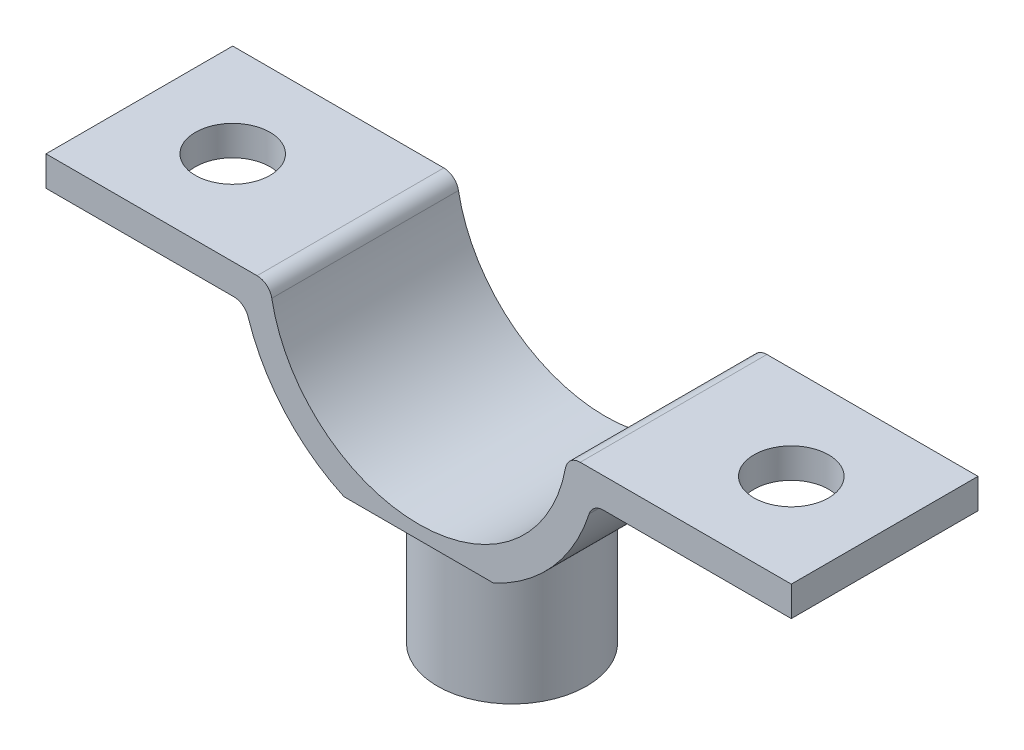
ISO-10303-21;
HEADER;
FILE_DESCRIPTION(('STEP AP214'),'2;1');
FILE_NAME('part.step','',(''),(''),'','','');
FILE_SCHEMA(('AUTOMOTIVE_DESIGN { 1 0 10303 214 1 1 1 1 }'));
ENDSEC;
DATA;
#1=APPLICATION_CONTEXT('core data for automotive mechanical design processes');
#2=APPLICATION_PROTOCOL_DEFINITION('international standard','automotive_design',2000,#1);
#3=PRODUCT_CONTEXT('',#1,'mechanical');
#4=PRODUCT('Part','Part','',(#3));
#5=PRODUCT_RELATED_PRODUCT_CATEGORY('part','',(#4));
#6=PRODUCT_DEFINITION_FORMATION('','',#4);
#7=PRODUCT_DEFINITION_CONTEXT('part definition',#1,'design');
#8=PRODUCT_DEFINITION('design','',#6,#7);
#9=PRODUCT_DEFINITION_SHAPE('','',#8);
#10=(LENGTH_UNIT() NAMED_UNIT(*) SI_UNIT(.MILLI.,.METRE.));
#11=(NAMED_UNIT(*) PLANE_ANGLE_UNIT() SI_UNIT($,.RADIAN.));
#12=(NAMED_UNIT(*) SI_UNIT($,.STERADIAN.) SOLID_ANGLE_UNIT());
#13=UNCERTAINTY_MEASURE_WITH_UNIT(LENGTH_MEASURE(1.E-05),#10,'distance_accuracy_value','');
#14=(GEOMETRIC_REPRESENTATION_CONTEXT(3) GLOBAL_UNCERTAINTY_ASSIGNED_CONTEXT((#13)) GLOBAL_UNIT_ASSIGNED_CONTEXT((#10,
#11,#12)) REPRESENTATION_CONTEXT('',''));
#15=CARTESIAN_POINT('',(0.,0.,0.));
#16=DIRECTION('',(0.,0.,1.));
#17=DIRECTION('',(1.,0.,0.));
#18=AXIS2_PLACEMENT_3D('',#15,#16,#17);
#19=CARTESIAN_POINT('',(12.369316876853,16.0173195198486,12.5));
#20=DIRECTION('',(0.,0.,-1.));
#21=DIRECTION('',(-1.,0.,0.));
#22=AXIS2_PLACEMENT_3D('',#19,#20,#21);
#23=CYLINDRICAL_SURFACE('',#22,1.);
#24=CARTESIAN_POINT('',(12.369316876853,16.0173195198486,0.));
#25=DIRECTION('',(0.,0.,-1.));
#26=DIRECTION('',(1.,0.,0.));
#27=AXIS2_PLACEMENT_3D('',#24,#25,#26);
#28=CIRCLE('',#27,1.);
#29=CARTESIAN_POINT('',(11.4178309632489,16.3250118275409,0.));
#30=VERTEX_POINT('',#29);
#31=CARTESIAN_POINT('',(12.369316876853,17.0173195198486,0.));
#32=VERTEX_POINT('',#31);
#33=EDGE_CURVE('E166',#30,#32,#28,.T.);
#34=ORIENTED_EDGE('',*,*,#33,.T.);
#35=DIRECTION('',(0.,0.,-1.));
#36=VECTOR('',#35,1.);
#37=CARTESIAN_POINT('',(12.369316876853,17.0173195198486,12.5));
#38=LINE('',#37,#36);
#39=CARTESIAN_POINT('',(12.369316876853,17.0173195198486,12.5));
#40=VERTEX_POINT('',#39);
#41=EDGE_CURVE('E164',#40,#32,#38,.T.);
#42=ORIENTED_EDGE('',*,*,#41,.F.);
#43=CARTESIAN_POINT('',(12.369316876853,16.0173195198486,12.5));
#44=DIRECTION('',(0.,0.,-1.));
#45=DIRECTION('',(1.,0.,0.));
#46=AXIS2_PLACEMENT_3D('',#43,#44,#45);
#47=CIRCLE('',#46,1.);
#48=CARTESIAN_POINT('',(11.4178309632489,16.3250118275409,12.5));
#49=VERTEX_POINT('',#48);
#50=EDGE_CURVE('E147',#49,#40,#47,.T.);
#51=ORIENTED_EDGE('',*,*,#50,.F.);
#52=DIRECTION('',(0.,0.,-1.));
#53=VECTOR('',#52,1.);
#54=CARTESIAN_POINT('',(11.4178309632489,16.3250118275409,12.5));
#55=LINE('',#54,#53);
#56=EDGE_CURVE('E169',#49,#30,#55,.T.);
#57=ORIENTED_EDGE('',*,*,#56,.T.);
#58=EDGE_LOOP('',(#34,#42,#51,#57));
#59=FACE_BOUND('',#58,.T.);
#60=ADVANCED_FACE('F44',(#59),#23,.F.);
#61=CARTESIAN_POINT('',(24.9498743710662,17.0173195198486,12.5));
#62=DIRECTION('',(0.,1.,0.));
#63=DIRECTION('',(0.,0.,1.));
#64=AXIS2_PLACEMENT_3D('',#61,#62,#63);
#65=PLANE('',#64);
#66=CARTESIAN_POINT('',(18.6998743710662,17.0173195198486,6.25));
#67=DIRECTION('',(0.,1.,0.));
#68=DIRECTION('',(0.,0.,1.));
#69=AXIS2_PLACEMENT_3D('',#66,#67,#68);
#70=CIRCLE('',#69,2.5);
#71=CARTESIAN_POINT('',(18.6998743710662,17.0173195198486,8.75));
#72=VERTEX_POINT('',#71);
#73=EDGE_CURVE('E335',#72,#72,#70,.F.);
#74=ORIENTED_EDGE('',*,*,#73,.F.);
#75=EDGE_LOOP('',(#74));
#76=FACE_BOUND('',#75,.T.);
#77=DIRECTION('',(1.,0.,0.));
#78=VECTOR('',#77,1.);
#79=CARTESIAN_POINT('',(24.9498743710662,17.0173195198486,0.));
#80=LINE('',#79,#78);
#81=CARTESIAN_POINT('',(24.9498743710662,17.0173195198486,0.));
#82=VERTEX_POINT('',#81);
#83=EDGE_CURVE('E216',#32,#82,#80,.T.);
#84=ORIENTED_EDGE('',*,*,#83,.T.);
#85=DIRECTION('',(0.,0.,-1.));
#86=VECTOR('',#85,1.);
#87=CARTESIAN_POINT('',(24.9498743710662,17.0173195198486,12.5));
#88=LINE('',#87,#86);
#89=CARTESIAN_POINT('',(24.9498743710662,17.0173195198486,12.5));
#90=VERTEX_POINT('',#89);
#91=EDGE_CURVE('E170',#90,#82,#88,.T.);
#92=ORIENTED_EDGE('',*,*,#91,.F.);
#93=DIRECTION('',(1.,0.,0.));
#94=VECTOR('',#93,1.);
#95=CARTESIAN_POINT('',(19.9498743710662,17.0173195198486,12.5));
#96=LINE('',#95,#94);
#97=EDGE_CURVE('E152',#40,#90,#96,.T.);
#98=ORIENTED_EDGE('',*,*,#97,.F.);
#99=ORIENTED_EDGE('',*,*,#41,.T.);
#100=EDGE_LOOP('',(#84,#92,#98,#99));
#101=FACE_BOUND('',#100,.T.);
#102=ADVANCED_FACE('F172',(#76,#101),#65,.F.);
#103=CARTESIAN_POINT('',(24.9498743710662,19.0173195198486,12.5));
#104=DIRECTION('',(-1.,0.,0.));
#105=DIRECTION('',(0.,0.,1.));
#106=AXIS2_PLACEMENT_3D('',#103,#104,#105);
#107=PLANE('',#106);
#108=DIRECTION('',(0.,1.,0.));
#109=VECTOR('',#108,1.);
#110=CARTESIAN_POINT('',(24.9498743710662,19.0173195198486,0.));
#111=LINE('',#110,#109);
#112=CARTESIAN_POINT('',(24.9498743710662,19.0173195198486,0.));
#113=VERTEX_POINT('',#112);
#114=EDGE_CURVE('E219',#82,#113,#111,.T.);
#115=ORIENTED_EDGE('',*,*,#114,.T.);
#116=DIRECTION('',(0.,0.,-1.));
#117=VECTOR('',#116,1.);
#118=CARTESIAN_POINT('',(24.9498743710662,19.0173195198486,12.5));
#119=LINE('',#118,#117);
#120=CARTESIAN_POINT('',(24.9498743710662,19.0173195198486,12.5));
#121=VERTEX_POINT('',#120);
#122=EDGE_CURVE('E177',#121,#113,#119,.T.);
#123=ORIENTED_EDGE('',*,*,#122,.F.);
#124=DIRECTION('',(0.,1.,0.));
#125=VECTOR('',#124,1.);
#126=CARTESIAN_POINT('',(24.9498743710662,19.0173195198486,12.5));
#127=LINE('',#126,#125);
#128=EDGE_CURVE('E68',#90,#121,#127,.T.);
#129=ORIENTED_EDGE('',*,*,#128,.F.);
#130=ORIENTED_EDGE('',*,*,#91,.T.);
#131=EDGE_LOOP('',(#115,#123,#129,#130));
#132=FACE_BOUND('',#131,.T.);
#133=ADVANCED_FACE('F388',(#132),#107,.F.);
#134=CARTESIAN_POINT('',(10.816653826392,19.0173195198486,12.5));
#135=DIRECTION('',(0.,-1.,0.));
#136=DIRECTION('',(0.,0.,-1.));
#137=AXIS2_PLACEMENT_3D('',#134,#135,#136);
#138=PLANE('',#137);
#139=CARTESIAN_POINT('',(18.6998743710661,19.0173195198487,6.25));
#140=DIRECTION('',(0.,1.,0.));
#141=DIRECTION('',(1.,0.,0.));
#142=AXIS2_PLACEMENT_3D('',#139,#140,#141);
#143=CIRCLE('',#142,2.5);
#144=CARTESIAN_POINT('',(21.1998743710662,19.0173195198487,6.25));
#145=VERTEX_POINT('',#144);
#146=EDGE_CURVE('E340',#145,#145,#143,.T.);
#147=ORIENTED_EDGE('',*,*,#146,.F.);
#148=EDGE_LOOP('',(#147));
#149=FACE_BOUND('',#148,.T.);
#150=DIRECTION('',(-1.,0.,0.));
#151=VECTOR('',#150,1.);
#152=CARTESIAN_POINT('',(10.816653826392,19.0173195198486,0.));
#153=LINE('',#152,#151);
#154=CARTESIAN_POINT('',(10.816653826392,19.0173195198486,0.));
#155=VERTEX_POINT('',#154);
#156=EDGE_CURVE('E113',#113,#155,#153,.T.);
#157=ORIENTED_EDGE('',*,*,#156,.T.);
#158=DIRECTION('',(0.,0.,-1.));
#159=VECTOR('',#158,1.);
#160=CARTESIAN_POINT('',(10.816653826392,19.0173195198486,12.5));
#161=LINE('',#160,#159);
#162=CARTESIAN_POINT('',(10.816653826392,19.0173195198486,12.5));
#163=VERTEX_POINT('',#162);
#164=EDGE_CURVE('E53',#163,#155,#161,.T.);
#165=ORIENTED_EDGE('',*,*,#164,.F.);
#166=DIRECTION('',(-1.,0.,0.));
#167=VECTOR('',#166,1.);
#168=CARTESIAN_POINT('',(19.9498743710662,19.0173195198486,12.5));
#169=LINE('',#168,#167);
#170=EDGE_CURVE('E119',#121,#163,#169,.T.);
#171=ORIENTED_EDGE('',*,*,#170,.F.);
#172=ORIENTED_EDGE('',*,*,#122,.T.);
#173=EDGE_LOOP('',(#157,#165,#171,#172));
#174=FACE_BOUND('',#173,.T.);
#175=ADVANCED_FACE('F46',(#149,#174),#138,.F.);
#176=CARTESIAN_POINT('',(10.816653826392,18.0173195198486,12.5));
#177=DIRECTION('',(0.,0.,-1.));
#178=DIRECTION('',(-1.,0.,0.));
#179=AXIS2_PLACEMENT_3D('',#176,#177,#178);
#180=CYLINDRICAL_SURFACE('',#179,1.);
#181=CARTESIAN_POINT('',(10.816653826392,18.0173195198486,0.));
#182=DIRECTION('',(0.,0.,1.));
#183=DIRECTION('',(1.,0.,0.));
#184=AXIS2_PLACEMENT_3D('',#181,#182,#183);
#185=CIRCLE('',#184,1.);
#186=CARTESIAN_POINT('',(9.83332166035634,18.1991377016668,0.));
#187=VERTEX_POINT('',#186);
#188=EDGE_CURVE('E183',#155,#187,#185,.T.);
#189=ORIENTED_EDGE('',*,*,#188,.T.);
#190=DIRECTION('',(0.,0.,-1.));
#191=VECTOR('',#190,1.);
#192=CARTESIAN_POINT('',(9.83332166035634,18.1991377016668,12.5));
#193=LINE('',#192,#191);
#194=CARTESIAN_POINT('',(9.83332166035634,18.1991377016668,12.5));
#195=VERTEX_POINT('',#194);
#196=EDGE_CURVE('E253',#195,#187,#193,.T.);
#197=ORIENTED_EDGE('',*,*,#196,.F.);
#198=CARTESIAN_POINT('',(10.816653826392,18.0173195198486,12.5));
#199=DIRECTION('',(0.,0.,1.));
#200=DIRECTION('',(1.,0.,0.));
#201=AXIS2_PLACEMENT_3D('',#198,#199,#200);
#202=CIRCLE('',#201,1.);
#203=EDGE_CURVE('E262',#163,#195,#202,.T.);
#204=ORIENTED_EDGE('',*,*,#203,.F.);
#205=ORIENTED_EDGE('',*,*,#164,.T.);
#206=EDGE_LOOP('',(#189,#197,#204,#205));
#207=FACE_BOUND('',#206,.T.);
#208=ADVANCED_FACE('F260',(#207),#180,.T.);
#209=CARTESIAN_POINT('',(0.,20.0173195198486,12.5));
#210=DIRECTION('',(0.,0.,-1.));
#211=DIRECTION('',(-1.,0.,0.));
#212=AXIS2_PLACEMENT_3D('',#209,#210,#211);
#213=CYLINDRICAL_SURFACE('',#212,10.);
#214=CARTESIAN_POINT('',(0.,20.0173195198486,0.));
#215=DIRECTION('',(0.,0.,-1.));
#216=DIRECTION('',(1.,0.,0.));
#217=AXIS2_PLACEMENT_3D('',#214,#215,#216);
#218=CIRCLE('',#217,10.);
#219=CARTESIAN_POINT('',(-9.83332166035634,18.1991377016668,0.));
#220=VERTEX_POINT('',#219);
#221=EDGE_CURVE('E187',#187,#220,#218,.T.);
#222=ORIENTED_EDGE('',*,*,#221,.T.);
#223=DIRECTION('',(0.,0.,-1.));
#224=VECTOR('',#223,1.);
#225=CARTESIAN_POINT('',(-9.83332166035634,18.1991377016668,12.5));
#226=LINE('',#225,#224);
#227=CARTESIAN_POINT('',(-9.83332166035634,18.1991377016668,12.5));
#228=VERTEX_POINT('',#227);
#229=EDGE_CURVE('E249',#228,#220,#226,.T.);
#230=ORIENTED_EDGE('',*,*,#229,.F.);
#231=CARTESIAN_POINT('',(0.,20.0173195198486,12.5));
#232=DIRECTION('',(0.,0.,-1.));
#233=DIRECTION('',(1.,0.,0.));
#234=AXIS2_PLACEMENT_3D('',#231,#232,#233);
#235=CIRCLE('',#234,10.);
#236=EDGE_CURVE('E279',#195,#228,#235,.T.);
#237=ORIENTED_EDGE('',*,*,#236,.F.);
#238=ORIENTED_EDGE('',*,*,#196,.T.);
#239=EDGE_LOOP('',(#222,#230,#237,#238));
#240=FACE_BOUND('',#239,.T.);
#241=ADVANCED_FACE('F269',(#240),#213,.F.);
#242=CARTESIAN_POINT('',(-10.816653826392,18.0173195198486,12.5));
#243=DIRECTION('',(0.,0.,-1.));
#244=DIRECTION('',(-1.,0.,0.));
#245=AXIS2_PLACEMENT_3D('',#242,#243,#244);
#246=CYLINDRICAL_SURFACE('',#245,1.);
#247=CARTESIAN_POINT('',(-10.816653826392,18.0173195198486,0.));
#248=DIRECTION('',(0.,0.,1.));
#249=DIRECTION('',(-1.,0.,0.));
#250=AXIS2_PLACEMENT_3D('',#247,#248,#249);
#251=CIRCLE('',#250,1.);
#252=CARTESIAN_POINT('',(-10.816653826392,19.0173195198486,0.));
#253=VERTEX_POINT('',#252);
#254=EDGE_CURVE('E190',#220,#253,#251,.T.);
#255=ORIENTED_EDGE('',*,*,#254,.T.);
#256=DIRECTION('',(0.,0.,-1.));
#257=VECTOR('',#256,1.);
#258=CARTESIAN_POINT('',(-10.816653826392,19.0173195198486,12.5));
#259=LINE('',#258,#257);
#260=CARTESIAN_POINT('',(-10.816653826392,19.0173195198486,12.5));
#261=VERTEX_POINT('',#260);
#262=EDGE_CURVE('E245',#261,#253,#259,.T.);
#263=ORIENTED_EDGE('',*,*,#262,.F.);
#264=CARTESIAN_POINT('',(-10.816653826392,18.0173195198486,12.5));
#265=DIRECTION('',(0.,0.,1.));
#266=DIRECTION('',(-1.,0.,0.));
#267=AXIS2_PLACEMENT_3D('',#264,#265,#266);
#268=CIRCLE('',#267,1.);
#269=EDGE_CURVE('E275',#228,#261,#268,.T.);
#270=ORIENTED_EDGE('',*,*,#269,.F.);
#271=ORIENTED_EDGE('',*,*,#229,.T.);
#272=EDGE_LOOP('',(#255,#263,#270,#271));
#273=FACE_BOUND('',#272,.T.);
#274=ADVANCED_FACE('F273',(#273),#246,.T.);
#275=CARTESIAN_POINT('',(-19.9498743710662,19.0173195198486,12.5));
#276=DIRECTION('',(0.,-1.,0.));
#277=DIRECTION('',(1.,0.,0.));
#278=AXIS2_PLACEMENT_3D('',#275,#276,#277);
#279=PLANE('',#278);
#280=CARTESIAN_POINT('',(-18.6998743710662,19.0173195198486,6.25));
#281=DIRECTION('',(0.,1.,0.));
#282=DIRECTION('',(-1.,0.,0.));
#283=AXIS2_PLACEMENT_3D('',#280,#281,#282);
#284=CIRCLE('',#283,2.5);
#285=CARTESIAN_POINT('',(-21.1998743710662,19.0173195198486,6.25));
#286=VERTEX_POINT('',#285);
#287=EDGE_CURVE('E339',#286,#286,#284,.T.);
#288=ORIENTED_EDGE('',*,*,#287,.F.);
#289=EDGE_LOOP('',(#288));
#290=FACE_BOUND('',#289,.T.);
#291=DIRECTION('',(-1.,0.,0.));
#292=VECTOR('',#291,1.);
#293=CARTESIAN_POINT('',(-19.9498743710662,19.0173195198486,0.));
#294=LINE('',#293,#292);
#295=CARTESIAN_POINT('',(-24.9498743710662,19.0173195198486,0.));
#296=VERTEX_POINT('',#295);
#297=EDGE_CURVE('E194',#253,#296,#294,.T.);
#298=ORIENTED_EDGE('',*,*,#297,.T.);
#299=DIRECTION('',(0.,0.,-1.));
#300=VECTOR('',#299,1.);
#301=CARTESIAN_POINT('',(-24.9498743710662,19.0173195198486,12.5));
#302=LINE('',#301,#300);
#303=CARTESIAN_POINT('',(-24.9498743710662,19.0173195198486,12.5));
#304=VERTEX_POINT('',#303);
#305=EDGE_CURVE('E241',#304,#296,#302,.T.);
#306=ORIENTED_EDGE('',*,*,#305,.F.);
#307=DIRECTION('',(-1.,0.,0.));
#308=VECTOR('',#307,1.);
#309=CARTESIAN_POINT('',(-10.816653826392,19.0173195198486,12.5));
#310=LINE('',#309,#308);
#311=EDGE_CURVE('E278',#261,#304,#310,.T.);
#312=ORIENTED_EDGE('',*,*,#311,.F.);
#313=ORIENTED_EDGE('',*,*,#262,.T.);
#314=EDGE_LOOP('',(#298,#306,#312,#313));
#315=FACE_BOUND('',#314,.T.);
#316=ADVANCED_FACE('F354',(#290,#315),#279,.F.);
#317=CARTESIAN_POINT('',(-24.9498743710662,19.0173195198486,12.5));
#318=DIRECTION('',(1.,0.,0.));
#319=DIRECTION('',(0.,0.,-1.));
#320=AXIS2_PLACEMENT_3D('',#317,#318,#319);
#321=PLANE('',#320);
#322=DIRECTION('',(0.,-1.,0.));
#323=VECTOR('',#322,1.);
#324=CARTESIAN_POINT('',(-24.9498743710662,19.0173195198486,0.));
#325=LINE('',#324,#323);
#326=CARTESIAN_POINT('',(-24.9498743710662,17.0173195198486,0.));
#327=VERTEX_POINT('',#326);
#328=EDGE_CURVE('E197',#296,#327,#325,.T.);
#329=ORIENTED_EDGE('',*,*,#328,.T.);
#330=DIRECTION('',(0.,0.,-1.));
#331=VECTOR('',#330,1.);
#332=CARTESIAN_POINT('',(-24.9498743710662,17.0173195198486,12.5));
#333=LINE('',#332,#331);
#334=CARTESIAN_POINT('',(-24.9498743710662,17.0173195198486,12.5));
#335=VERTEX_POINT('',#334);
#336=EDGE_CURVE('E237',#335,#327,#333,.T.);
#337=ORIENTED_EDGE('',*,*,#336,.F.);
#338=DIRECTION('',(0.,-1.,0.));
#339=VECTOR('',#338,1.);
#340=CARTESIAN_POINT('',(-24.9498743710662,19.0173195198486,12.5));
#341=LINE('',#340,#339);
#342=EDGE_CURVE('E283',#304,#335,#341,.T.);
#343=ORIENTED_EDGE('',*,*,#342,.F.);
#344=ORIENTED_EDGE('',*,*,#305,.T.);
#345=EDGE_LOOP('',(#329,#337,#343,#344));
#346=FACE_BOUND('',#345,.T.);
#347=ADVANCED_FACE('F357',(#346),#321,.F.);
#348=CARTESIAN_POINT('',(-19.9498743710662,17.0173195198486,12.5));
#349=DIRECTION('',(0.,1.,0.));
#350=DIRECTION('',(0.,0.,1.));
#351=AXIS2_PLACEMENT_3D('',#348,#349,#350);
#352=PLANE('',#351);
#353=CARTESIAN_POINT('',(-18.6998743710662,17.0173195198486,6.25));
#354=DIRECTION('',(0.,1.,0.));
#355=DIRECTION('',(0.,0.,1.));
#356=AXIS2_PLACEMENT_3D('',#353,#354,#355);
#357=CIRCLE('',#356,2.5);
#358=CARTESIAN_POINT('',(-18.6998743710662,17.0173195198486,8.75));
#359=VERTEX_POINT('',#358);
#360=EDGE_CURVE('E331',#359,#359,#357,.F.);
#361=ORIENTED_EDGE('',*,*,#360,.F.);
#362=EDGE_LOOP('',(#361));
#363=FACE_BOUND('',#362,.T.);
#364=DIRECTION('',(1.,0.,0.));
#365=VECTOR('',#364,1.);
#366=CARTESIAN_POINT('',(-19.9498743710662,17.0173195198486,0.));
#367=LINE('',#366,#365);
#368=CARTESIAN_POINT('',(-12.369316876853,17.0173195198486,0.));
#369=VERTEX_POINT('',#368);
#370=EDGE_CURVE('E201',#327,#369,#367,.T.);
#371=ORIENTED_EDGE('',*,*,#370,.T.);
#372=DIRECTION('',(0.,0.,-1.));
#373=VECTOR('',#372,1.);
#374=CARTESIAN_POINT('',(-12.369316876853,17.0173195198486,12.5));
#375=LINE('',#374,#373);
#376=CARTESIAN_POINT('',(-12.369316876853,17.0173195198486,12.5));
#377=VERTEX_POINT('',#376);
#378=EDGE_CURVE('E233',#377,#369,#375,.T.);
#379=ORIENTED_EDGE('',*,*,#378,.F.);
#380=DIRECTION('',(1.,0.,0.));
#381=VECTOR('',#380,1.);
#382=CARTESIAN_POINT('',(-24.9498743710662,17.0173195198486,12.5));
#383=LINE('',#382,#381);
#384=EDGE_CURVE('E290',#335,#377,#383,.T.);
#385=ORIENTED_EDGE('',*,*,#384,.F.);
#386=ORIENTED_EDGE('',*,*,#336,.T.);
#387=EDGE_LOOP('',(#371,#379,#385,#386));
#388=FACE_BOUND('',#387,.T.);
#389=ADVANCED_FACE('F367',(#363,#388),#352,.F.);
#390=CARTESIAN_POINT('',(-12.369316876853,16.0173195198486,12.5));
#391=DIRECTION('',(0.,0.,-1.));
#392=DIRECTION('',(-1.,0.,0.));
#393=AXIS2_PLACEMENT_3D('',#390,#391,#392);
#394=CYLINDRICAL_SURFACE('',#393,1.);
#395=CARTESIAN_POINT('',(-12.369316876853,16.0173195198486,0.));
#396=DIRECTION('',(0.,0.,-1.));
#397=DIRECTION('',(-1.,0.,0.));
#398=AXIS2_PLACEMENT_3D('',#395,#396,#397);
#399=CIRCLE('',#398,1.);
#400=CARTESIAN_POINT('',(-11.4178309632489,16.3250118275409,0.));
#401=VERTEX_POINT('',#400);
#402=EDGE_CURVE('E204',#369,#401,#399,.T.);
#403=ORIENTED_EDGE('',*,*,#402,.T.);
#404=DIRECTION('',(0.,0.,-1.));
#405=VECTOR('',#404,1.);
#406=CARTESIAN_POINT('',(-11.4178309632489,16.3250118275409,12.5));
#407=LINE('',#406,#405);
#408=CARTESIAN_POINT('',(-11.4178309632489,16.3250118275409,12.5));
#409=VERTEX_POINT('',#408);
#410=EDGE_CURVE('E229',#409,#401,#407,.T.);
#411=ORIENTED_EDGE('',*,*,#410,.F.);
#412=CARTESIAN_POINT('',(-12.369316876853,16.0173195198486,12.5));
#413=DIRECTION('',(0.,0.,-1.));
#414=DIRECTION('',(-1.,0.,0.));
#415=AXIS2_PLACEMENT_3D('',#412,#413,#414);
#416=CIRCLE('',#415,1.);
#417=EDGE_CURVE('E293',#377,#409,#416,.T.);
#418=ORIENTED_EDGE('',*,*,#417,.F.);
#419=ORIENTED_EDGE('',*,*,#378,.T.);
#420=EDGE_LOOP('',(#403,#411,#418,#419));
#421=FACE_BOUND('',#420,.T.);
#422=ADVANCED_FACE('F370',(#421),#394,.F.);
#423=CARTESIAN_POINT('',(12.369316876853,16.0173195198486,12.5));
#424=DIRECTION('',(0.,0.,1.));
#425=DIRECTION('',(1.,0.,0.));
#426=AXIS2_PLACEMENT_3D('',#423,#424,#425);
#427=PLANE('',#426);
#428=CARTESIAN_POINT('',(0.,20.0173195198486,12.5));
#429=DIRECTION('',(0.,0.,1.));
#430=DIRECTION('',(1.,0.,0.));
#431=AXIS2_PLACEMENT_3D('',#428,#429,#430);
#432=CIRCLE('',#431,12.);
#433=CARTESIAN_POINT('',(-5.0030371667547,9.11,12.5));
#434=VERTEX_POINT('',#433);
#435=EDGE_CURVE('E296',#409,#434,#432,.T.);
#436=ORIENTED_EDGE('',*,*,#435,.T.);
#437=DIRECTION('',(1.,0.,0.));
#438=VECTOR('',#437,1.);
#439=CARTESIAN_POINT('',(12.369316876853,9.11,12.5));
#440=LINE('',#439,#438);
#441=CARTESIAN_POINT('',(5.0030371667547,9.11,12.5));
#442=VERTEX_POINT('',#441);
#443=EDGE_CURVE('E184',#434,#442,#440,.T.);
#444=ORIENTED_EDGE('',*,*,#443,.T.);
#445=CARTESIAN_POINT('',(0.,20.0173195198486,12.5));
#446=DIRECTION('',(0.,0.,1.));
#447=DIRECTION('',(1.,0.,0.));
#448=AXIS2_PLACEMENT_3D('',#445,#446,#447);
#449=CIRCLE('',#448,12.);
#450=EDGE_CURVE('E156',#442,#49,#449,.T.);
#451=ORIENTED_EDGE('',*,*,#450,.T.);
#452=ORIENTED_EDGE('',*,*,#50,.T.);
#453=ORIENTED_EDGE('',*,*,#97,.T.);
#454=ORIENTED_EDGE('',*,*,#128,.T.);
#455=ORIENTED_EDGE('',*,*,#170,.T.);
#456=ORIENTED_EDGE('',*,*,#203,.T.);
#457=ORIENTED_EDGE('',*,*,#236,.T.);
#458=ORIENTED_EDGE('',*,*,#269,.T.);
#459=ORIENTED_EDGE('',*,*,#311,.T.);
#460=ORIENTED_EDGE('',*,*,#342,.T.);
#461=ORIENTED_EDGE('',*,*,#384,.T.);
#462=ORIENTED_EDGE('',*,*,#417,.T.);
#463=EDGE_LOOP('',(#436,#444,#451,#452,#453,#454,#455,#456,#457,#458,#459,#460,#461,#462));
#464=FACE_BOUND('',#463,.T.);
#465=ADVANCED_FACE('F150',(#464),#427,.T.);
#466=CARTESIAN_POINT('',(12.369316876853,16.0173195198486,0.));
#467=DIRECTION('',(0.,0.,1.));
#468=DIRECTION('',(1.,0.,0.));
#469=AXIS2_PLACEMENT_3D('',#466,#467,#468);
#470=PLANE('',#469);
#471=DIRECTION('',(1.,0.,0.));
#472=VECTOR('',#471,1.);
#473=CARTESIAN_POINT('',(12.369316876853,9.11,0.));
#474=LINE('',#473,#472);
#475=CARTESIAN_POINT('',(-5.0030371667547,9.11,0.));
#476=VERTEX_POINT('',#475);
#477=CARTESIAN_POINT('',(5.0030371667547,9.11,0.));
#478=VERTEX_POINT('',#477);
#479=EDGE_CURVE('E12',#476,#478,#474,.T.);
#480=ORIENTED_EDGE('',*,*,#479,.F.);
#481=CARTESIAN_POINT('',(0.,20.0173195198486,0.));
#482=DIRECTION('',(0.,0.,1.));
#483=DIRECTION('',(1.,0.,0.));
#484=AXIS2_PLACEMENT_3D('',#481,#482,#483);
#485=CIRCLE('',#484,12.);
#486=EDGE_CURVE('E207',#401,#476,#485,.T.);
#487=ORIENTED_EDGE('',*,*,#486,.F.);
#488=ORIENTED_EDGE('',*,*,#402,.F.);
#489=ORIENTED_EDGE('',*,*,#370,.F.);
#490=ORIENTED_EDGE('',*,*,#328,.F.);
#491=ORIENTED_EDGE('',*,*,#297,.F.);
#492=ORIENTED_EDGE('',*,*,#254,.F.);
#493=ORIENTED_EDGE('',*,*,#221,.F.);
#494=ORIENTED_EDGE('',*,*,#188,.F.);
#495=ORIENTED_EDGE('',*,*,#156,.F.);
#496=ORIENTED_EDGE('',*,*,#114,.F.);
#497=ORIENTED_EDGE('',*,*,#83,.F.);
#498=ORIENTED_EDGE('',*,*,#33,.F.);
#499=CARTESIAN_POINT('',(0.,20.0173195198486,0.));
#500=DIRECTION('',(0.,0.,1.));
#501=DIRECTION('',(1.,0.,0.));
#502=AXIS2_PLACEMENT_3D('',#499,#500,#501);
#503=CIRCLE('',#502,12.);
#504=EDGE_CURVE('E211',#478,#30,#503,.T.);
#505=ORIENTED_EDGE('',*,*,#504,.F.);
#506=EDGE_LOOP('',(#480,#487,#488,#489,#490,#491,#492,#493,#494,#495,#496,#497,#498,#505));
#507=FACE_BOUND('',#506,.T.);
#508=ADVANCED_FACE('F265',(#507),#470,.F.);
#509=CARTESIAN_POINT('',(0.,20.0173195198486,12.5));
#510=DIRECTION('',(0.,0.,-1.));
#511=DIRECTION('',(-1.,0.,0.));
#512=AXIS2_PLACEMENT_3D('',#509,#510,#511);
#513=CYLINDRICAL_SURFACE('',#512,12.);
#514=DIRECTION('',(0.,0.,-1.));
#515=VECTOR('',#514,1.);
#516=CARTESIAN_POINT('',(5.0030371667547,9.11,12.5));
#517=LINE('',#516,#515);
#518=EDGE_CURVE('E307',#478,#442,#517,.F.);
#519=ORIENTED_EDGE('',*,*,#518,.F.);
#520=ORIENTED_EDGE('',*,*,#504,.T.);
#521=ORIENTED_EDGE('',*,*,#56,.F.);
#522=ORIENTED_EDGE('',*,*,#450,.F.);
#523=EDGE_LOOP('',(#519,#520,#521,#522));
#524=FACE_BOUND('',#523,.T.);
#525=ADVANCED_FACE('F393',(#524),#513,.T.);
#526=CARTESIAN_POINT('',(0.,20.0173195198486,12.5));
#527=DIRECTION('',(0.,0.,-1.));
#528=DIRECTION('',(-1.,0.,0.));
#529=AXIS2_PLACEMENT_3D('',#526,#527,#528);
#530=CYLINDRICAL_SURFACE('',#529,12.);
#531=DIRECTION('',(0.,0.,-1.));
#532=VECTOR('',#531,1.);
#533=CARTESIAN_POINT('',(-5.0030371667547,9.11,12.5));
#534=LINE('',#533,#532);
#535=EDGE_CURVE('E59',#434,#476,#534,.T.);
#536=ORIENTED_EDGE('',*,*,#535,.F.);
#537=ORIENTED_EDGE('',*,*,#435,.F.);
#538=ORIENTED_EDGE('',*,*,#410,.T.);
#539=ORIENTED_EDGE('',*,*,#486,.T.);
#540=EDGE_LOOP('',(#536,#537,#538,#539));
#541=FACE_BOUND('',#540,.T.);
#542=ADVANCED_FACE('F304',(#541),#530,.T.);
#543=CARTESIAN_POINT('',(0.,9.11,6.25));
#544=DIRECTION('',(0.,-1.,0.));
#545=DIRECTION('',(1.,0.,0.));
#546=AXIS2_PLACEMENT_3D('',#543,#544,#545);
#547=PLANE('',#546);
#548=ORIENTED_EDGE('',*,*,#535,.T.);
#549=ORIENTED_EDGE('',*,*,#479,.T.);
#550=ORIENTED_EDGE('',*,*,#518,.T.);
#551=ORIENTED_EDGE('',*,*,#443,.F.);
#552=EDGE_LOOP('',(#548,#549,#550,#551));
#553=FACE_BOUND('',#552,.T.);
#554=CARTESIAN_POINT('',(0.,9.11,6.25));
#555=DIRECTION('',(0.,-1.,0.));
#556=DIRECTION('',(1.,0.,0.));
#557=AXIS2_PLACEMENT_3D('',#554,#555,#556);
#558=CIRCLE('',#557,4.99999999999773);
#559=CARTESIAN_POINT('',(4.99999999999773,9.11,6.25));
#560=VERTEX_POINT('',#559);
#561=EDGE_CURVE('E313',#560,#560,#558,.T.);
#562=ORIENTED_EDGE('',*,*,#561,.F.);
#563=EDGE_LOOP('',(#562));
#564=FACE_BOUND('',#563,.T.);
#565=ADVANCED_FACE('F403',(#553,#564),#547,.T.);
#566=CARTESIAN_POINT('',(0.,9.11,6.25));
#567=DIRECTION('',(0.,-1.,0.));
#568=DIRECTION('',(1.,0.,0.));
#569=AXIS2_PLACEMENT_3D('',#566,#567,#568);
#570=CYLINDRICAL_SURFACE('',#569,4.99999999999773);
#571=CARTESIAN_POINT('',(0.,0.,6.25));
#572=DIRECTION('',(0.,-1.,0.));
#573=DIRECTION('',(1.,0.,0.));
#574=AXIS2_PLACEMENT_3D('',#571,#572,#573);
#575=CIRCLE('',#574,4.99999999999773);
#576=CARTESIAN_POINT('',(4.99999999999773,0.,6.25));
#577=VERTEX_POINT('',#576);
#578=EDGE_CURVE('E319',#577,#577,#575,.T.);
#579=ORIENTED_EDGE('',*,*,#578,.F.);
#580=EDGE_LOOP('',(#579));
#581=FACE_BOUND('',#580,.T.);
#582=ORIENTED_EDGE('',*,*,#561,.T.);
#583=EDGE_LOOP('',(#582));
#584=FACE_BOUND('',#583,.T.);
#585=ADVANCED_FACE('F400',(#581,#584),#570,.T.);
#586=CARTESIAN_POINT('',(4.99999999999773,0.,12.5));
#587=DIRECTION('',(0.,1.,0.));
#588=DIRECTION('',(-1.,0.,0.));
#589=AXIS2_PLACEMENT_3D('',#586,#587,#588);
#590=PLANE('',#589);
#591=CARTESIAN_POINT('',(0.,0.,6.25));
#592=DIRECTION('',(0.,-1.,0.));
#593=DIRECTION('',(1.,0.,0.));
#594=AXIS2_PLACEMENT_3D('',#591,#592,#593);
#595=CIRCLE('',#594,3.);
#596=CARTESIAN_POINT('',(3.,0.,6.25));
#597=VERTEX_POINT('',#596);
#598=EDGE_CURVE('E327',#597,#597,#595,.T.);
#599=ORIENTED_EDGE('',*,*,#598,.F.);
#600=EDGE_LOOP('',(#599));
#601=FACE_BOUND('',#600,.T.);
#602=ORIENTED_EDGE('',*,*,#578,.T.);
#603=EDGE_LOOP('',(#602));
#604=FACE_BOUND('',#603,.T.);
#605=ADVANCED_FACE('F397',(#601,#604),#590,.F.);
#606=CARTESIAN_POINT('',(0.,9.11,6.25));
#607=DIRECTION('',(0.,-1.,0.));
#608=DIRECTION('',(1.,0.,0.));
#609=AXIS2_PLACEMENT_3D('',#606,#607,#608);
#610=CYLINDRICAL_SURFACE('',#609,3.);
#611=CARTESIAN_POINT('',(0.,9.11,6.25));
#612=DIRECTION('',(0.,-1.,0.));
#613=DIRECTION('',(1.,0.,0.));
#614=AXIS2_PLACEMENT_3D('',#611,#612,#613);
#615=CIRCLE('',#614,3.);
#616=CARTESIAN_POINT('',(3.,9.11,6.25));
#617=VERTEX_POINT('',#616);
#618=EDGE_CURVE('E323',#617,#617,#615,.T.);
#619=ORIENTED_EDGE('',*,*,#618,.F.);
#620=EDGE_LOOP('',(#619));
#621=FACE_BOUND('',#620,.T.);
#622=ORIENTED_EDGE('',*,*,#598,.T.);
#623=EDGE_LOOP('',(#622));
#624=FACE_BOUND('',#623,.T.);
#625=ADVANCED_FACE('F399',(#621,#624),#610,.F.);
#626=CARTESIAN_POINT('',(0.,9.11,6.25));
#627=DIRECTION('',(0.,-1.,0.));
#628=DIRECTION('',(1.,0.,0.));
#629=AXIS2_PLACEMENT_3D('',#626,#627,#628);
#630=PLANE('',#629);
#631=ORIENTED_EDGE('',*,*,#618,.T.);
#632=EDGE_LOOP('',(#631));
#633=FACE_BOUND('',#632,.T.);
#634=ADVANCED_FACE('F439',(#633),#630,.T.);
#635=CARTESIAN_POINT('',(-18.6998743710662,-0.00100000000005998,6.25));
#636=DIRECTION('',(0.,1.,0.));
#637=DIRECTION('',(-1.,0.,0.));
#638=AXIS2_PLACEMENT_3D('',#635,#636,#637);
#639=CYLINDRICAL_SURFACE('',#638,2.5);
#640=ORIENTED_EDGE('',*,*,#287,.T.);
#641=EDGE_LOOP('',(#640));
#642=FACE_BOUND('',#641,.T.);
#643=ORIENTED_EDGE('',*,*,#360,.T.);
#644=EDGE_LOOP('',(#643));
#645=FACE_BOUND('',#644,.T.);
#646=ADVANCED_FACE('F351',(#642,#645),#639,.F.);
#647=CARTESIAN_POINT('',(18.6998743710662,-0.00100000000001141,6.25));
#648=DIRECTION('',(0.,1.,0.));
#649=DIRECTION('',(-1.,0.,0.));
#650=AXIS2_PLACEMENT_3D('',#647,#648,#649);
#651=CYLINDRICAL_SURFACE('',#650,2.5);
#652=ORIENTED_EDGE('',*,*,#146,.T.);
#653=EDGE_LOOP('',(#652));
#654=FACE_BOUND('',#653,.T.);
#655=ORIENTED_EDGE('',*,*,#73,.T.);
#656=EDGE_LOOP('',(#655));
#657=FACE_BOUND('',#656,.T.);
#658=ADVANCED_FACE('F431',(#654,#657),#651,.F.);
#659=CLOSED_SHELL('',(#60,#102,#133,#175,#208,#241,#274,#316,#347,#389,#422,#465,#508,#525,#542,
#565,#585,#605,#625,#634,#646,#658));
#660=MANIFOLD_SOLID_BREP('B2',#659);
#661=ADVANCED_BREP_SHAPE_REPRESENTATION('',(#18,#660),#14);
#662=SHAPE_DEFINITION_REPRESENTATION(#9,#661);
ENDSEC;
END-ISO-10303-21;
